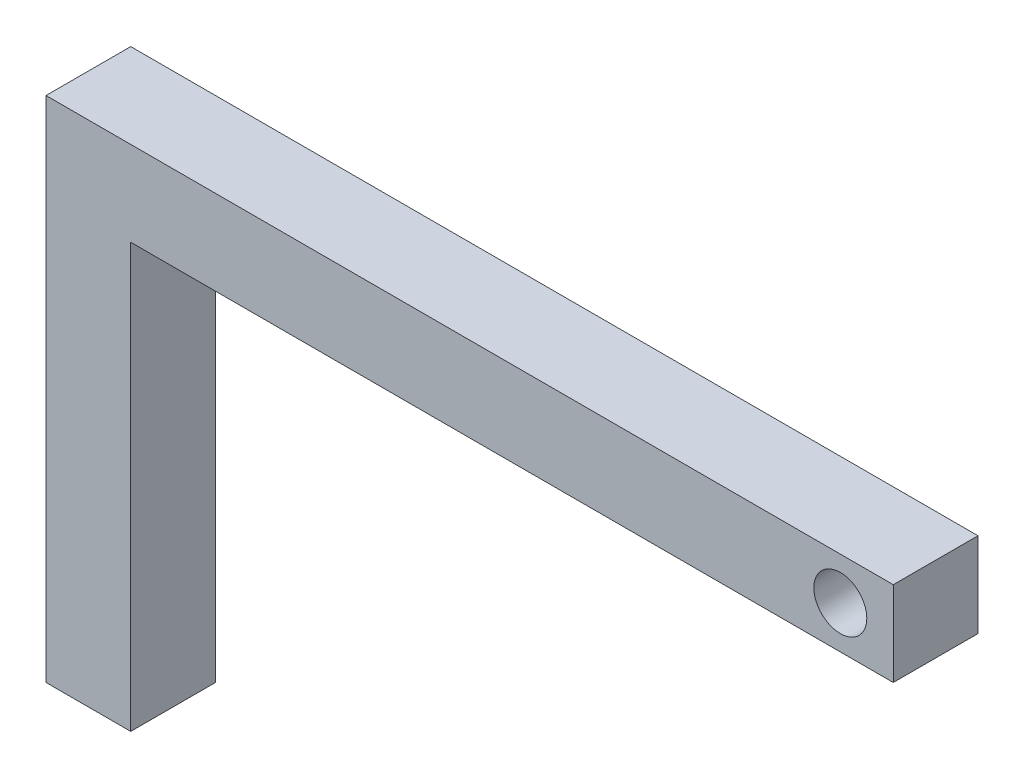
ISO-10303-21;
HEADER;
FILE_DESCRIPTION(('STEP AP214'),'2;1');
FILE_NAME('part.step','',(''),(''),'','','');
FILE_SCHEMA(('AUTOMOTIVE_DESIGN { 1 0 10303 214 1 1 1 1 }'));
ENDSEC;
DATA;
#1=APPLICATION_CONTEXT('core data for automotive mechanical design processes');
#2=APPLICATION_PROTOCOL_DEFINITION('international standard','automotive_design',2000,#1);
#3=PRODUCT_CONTEXT('',#1,'mechanical');
#4=PRODUCT('Part','Part','',(#3));
#5=PRODUCT_RELATED_PRODUCT_CATEGORY('part','',(#4));
#6=PRODUCT_DEFINITION_FORMATION('','',#4);
#7=PRODUCT_DEFINITION_CONTEXT('part definition',#1,'design');
#8=PRODUCT_DEFINITION('design','',#6,#7);
#9=PRODUCT_DEFINITION_SHAPE('','',#8);
#10=(LENGTH_UNIT() NAMED_UNIT(*) SI_UNIT(.MILLI.,.METRE.));
#11=(NAMED_UNIT(*) PLANE_ANGLE_UNIT() SI_UNIT($,.RADIAN.));
#12=(NAMED_UNIT(*) SI_UNIT($,.STERADIAN.) SOLID_ANGLE_UNIT());
#13=UNCERTAINTY_MEASURE_WITH_UNIT(LENGTH_MEASURE(1.E-05),#10,'distance_accuracy_value','');
#14=(GEOMETRIC_REPRESENTATION_CONTEXT(3) GLOBAL_UNCERTAINTY_ASSIGNED_CONTEXT((#13)) GLOBAL_UNIT_ASSIGNED_CONTEXT((#10,
#11,#12)) REPRESENTATION_CONTEXT('',''));
#15=CARTESIAN_POINT('',(0.,0.,0.));
#16=DIRECTION('',(0.,0.,1.));
#17=DIRECTION('',(1.,0.,0.));
#18=AXIS2_PLACEMENT_3D('',#15,#16,#17);
#19=CARTESIAN_POINT('',(80.,0.,80.));
#20=DIRECTION('',(0.,1.,0.));
#21=DIRECTION('',(0.,0.,1.));
#22=AXIS2_PLACEMENT_3D('',#19,#20,#21);
#23=PLANE('',#22);
#24=CARTESIAN_POINT('',(40.,0.,40.));
#25=DIRECTION('',(0.,-1.,0.));
#26=DIRECTION('',(0.,0.,-1.));
#27=AXIS2_PLACEMENT_3D('',#24,#25,#26);
#28=CIRCLE('',#27,15.);
#29=CARTESIAN_POINT('',(40.,0.,25.));
#30=VERTEX_POINT('',#29);
#31=EDGE_CURVE('E166',#30,#30,#28,.T.);
#32=ORIENTED_EDGE('',*,*,#31,.F.);
#33=EDGE_LOOP('',(#32));
#34=FACE_BOUND('',#33,.T.);
#35=DIRECTION('',(1.,0.,0.));
#36=VECTOR('',#35,1.);
#37=CARTESIAN_POINT('',(80.,0.,0.));
#38=LINE('',#37,#36);
#39=CARTESIAN_POINT('',(0.,0.,0.));
#40=VERTEX_POINT('',#39);
#41=CARTESIAN_POINT('',(80.,0.,0.));
#42=VERTEX_POINT('',#41);
#43=EDGE_CURVE('E123',#40,#42,#38,.T.);
#44=ORIENTED_EDGE('',*,*,#43,.T.);
#45=DIRECTION('',(0.,0.,-1.));
#46=VECTOR('',#45,1.);
#47=CARTESIAN_POINT('',(80.,0.,80.));
#48=LINE('',#47,#46);
#49=CARTESIAN_POINT('',(80.,0.,80.));
#50=VERTEX_POINT('',#49);
#51=EDGE_CURVE('E11',#50,#42,#48,.T.);
#52=ORIENTED_EDGE('',*,*,#51,.F.);
#53=DIRECTION('',(1.,0.,0.));
#54=VECTOR('',#53,1.);
#55=CARTESIAN_POINT('',(80.,0.,80.));
#56=LINE('',#55,#54);
#57=CARTESIAN_POINT('',(0.,0.,80.));
#58=VERTEX_POINT('',#57);
#59=EDGE_CURVE('E133',#58,#50,#56,.T.);
#60=ORIENTED_EDGE('',*,*,#59,.F.);
#61=DIRECTION('',(0.,0.,-1.));
#62=VECTOR('',#61,1.);
#63=CARTESIAN_POINT('',(0.,0.,80.));
#64=LINE('',#63,#62);
#65=EDGE_CURVE('E119',#58,#40,#64,.T.);
#66=ORIENTED_EDGE('',*,*,#65,.T.);
#67=EDGE_LOOP('',(#44,#52,#60,#66));
#68=FACE_BOUND('',#67,.T.);
#69=ADVANCED_FACE('F38',(#34,#68),#23,.F.);
#70=CARTESIAN_POINT('',(80.,400.000000000005,80.));
#71=DIRECTION('',(-1.,0.,0.));
#72=DIRECTION('',(0.,-1.,0.));
#73=AXIS2_PLACEMENT_3D('',#70,#71,#72);
#74=PLANE('',#73);
#75=DIRECTION('',(0.,1.,0.));
#76=VECTOR('',#75,1.);
#77=CARTESIAN_POINT('',(80.,400.000000000005,0.));
#78=LINE('',#77,#76);
#79=CARTESIAN_POINT('',(80.,400.000000000005,0.));
#80=VERTEX_POINT('',#79);
#81=EDGE_CURVE('E126',#42,#80,#78,.T.);
#82=ORIENTED_EDGE('',*,*,#81,.T.);
#83=DIRECTION('',(0.,0.,-1.));
#84=VECTOR('',#83,1.);
#85=CARTESIAN_POINT('',(80.,400.000000000005,80.));
#86=LINE('',#85,#84);
#87=CARTESIAN_POINT('',(80.,400.000000000005,80.));
#88=VERTEX_POINT('',#87);
#89=EDGE_CURVE('E47',#88,#80,#86,.T.);
#90=ORIENTED_EDGE('',*,*,#89,.F.);
#91=DIRECTION('',(0.,1.,0.));
#92=VECTOR('',#91,1.);
#93=CARTESIAN_POINT('',(80.,400.000000000005,80.));
#94=LINE('',#93,#92);
#95=EDGE_CURVE('E92',#50,#88,#94,.T.);
#96=ORIENTED_EDGE('',*,*,#95,.F.);
#97=ORIENTED_EDGE('',*,*,#51,.T.);
#98=EDGE_LOOP('',(#82,#90,#96,#97));
#99=FACE_BOUND('',#98,.T.);
#100=ADVANCED_FACE('F159',(#99),#74,.F.);
#101=CARTESIAN_POINT('',(800.,400.000000000005,80.));
#102=DIRECTION('',(0.,1.,0.));
#103=DIRECTION('',(-1.,0.,0.));
#104=AXIS2_PLACEMENT_3D('',#101,#102,#103);
#105=PLANE('',#104);
#106=DIRECTION('',(1.,0.,0.));
#107=VECTOR('',#106,1.);
#108=CARTESIAN_POINT('',(800.,400.000000000005,0.));
#109=LINE('',#108,#107);
#110=CARTESIAN_POINT('',(800.,400.000000000005,0.));
#111=VERTEX_POINT('',#110);
#112=EDGE_CURVE('E128',#80,#111,#109,.T.);
#113=ORIENTED_EDGE('',*,*,#112,.T.);
#114=DIRECTION('',(0.,0.,-1.));
#115=VECTOR('',#114,1.);
#116=CARTESIAN_POINT('',(800.,400.000000000005,80.));
#117=LINE('',#116,#115);
#118=CARTESIAN_POINT('',(800.,400.000000000005,80.));
#119=VERTEX_POINT('',#118);
#120=EDGE_CURVE('E114',#119,#111,#117,.T.);
#121=ORIENTED_EDGE('',*,*,#120,.F.);
#122=DIRECTION('',(1.,0.,0.));
#123=VECTOR('',#122,1.);
#124=CARTESIAN_POINT('',(800.,400.000000000005,80.));
#125=LINE('',#124,#123);
#126=EDGE_CURVE('E105',#88,#119,#125,.T.);
#127=ORIENTED_EDGE('',*,*,#126,.F.);
#128=ORIENTED_EDGE('',*,*,#89,.T.);
#129=EDGE_LOOP('',(#113,#121,#127,#128));
#130=FACE_BOUND('',#129,.T.);
#131=ADVANCED_FACE('F140',(#130),#105,.F.);
#132=CARTESIAN_POINT('',(800.,480.000000000005,80.));
#133=DIRECTION('',(-1.,0.,0.));
#134=DIRECTION('',(0.,0.,1.));
#135=AXIS2_PLACEMENT_3D('',#132,#133,#134);
#136=PLANE('',#135);
#137=DIRECTION('',(0.,1.,0.));
#138=VECTOR('',#137,1.);
#139=CARTESIAN_POINT('',(800.,480.000000000005,0.));
#140=LINE('',#139,#138);
#141=CARTESIAN_POINT('',(800.,480.000000000005,0.));
#142=VERTEX_POINT('',#141);
#143=EDGE_CURVE('E113',#111,#142,#140,.T.);
#144=ORIENTED_EDGE('',*,*,#143,.T.);
#145=DIRECTION('',(0.,0.,-1.));
#146=VECTOR('',#145,1.);
#147=CARTESIAN_POINT('',(800.,480.000000000005,80.));
#148=LINE('',#147,#146);
#149=CARTESIAN_POINT('',(800.,480.000000000005,80.));
#150=VERTEX_POINT('',#149);
#151=EDGE_CURVE('E110',#150,#142,#148,.T.);
#152=ORIENTED_EDGE('',*,*,#151,.F.);
#153=DIRECTION('',(0.,1.,0.));
#154=VECTOR('',#153,1.);
#155=CARTESIAN_POINT('',(800.,480.000000000005,80.));
#156=LINE('',#155,#154);
#157=EDGE_CURVE('E99',#119,#150,#156,.T.);
#158=ORIENTED_EDGE('',*,*,#157,.F.);
#159=ORIENTED_EDGE('',*,*,#120,.T.);
#160=EDGE_LOOP('',(#144,#152,#158,#159));
#161=FACE_BOUND('',#160,.T.);
#162=ADVANCED_FACE('F111',(#161),#136,.F.);
#163=CARTESIAN_POINT('',(0.,480.000000000005,80.));
#164=DIRECTION('',(0.,-1.,0.));
#165=DIRECTION('',(1.,0.,0.));
#166=AXIS2_PLACEMENT_3D('',#163,#164,#165);
#167=PLANE('',#166);
#168=DIRECTION('',(-1.,0.,0.));
#169=VECTOR('',#168,1.);
#170=CARTESIAN_POINT('',(0.,480.000000000005,0.));
#171=LINE('',#170,#169);
#172=CARTESIAN_POINT('',(0.,480.000000000005,0.));
#173=VERTEX_POINT('',#172);
#174=EDGE_CURVE('E78',#142,#173,#171,.T.);
#175=ORIENTED_EDGE('',*,*,#174,.T.);
#176=DIRECTION('',(0.,0.,-1.));
#177=VECTOR('',#176,1.);
#178=CARTESIAN_POINT('',(0.,480.000000000005,80.));
#179=LINE('',#178,#177);
#180=CARTESIAN_POINT('',(0.,480.000000000005,80.));
#181=VERTEX_POINT('',#180);
#182=EDGE_CURVE('E115',#181,#173,#179,.T.);
#183=ORIENTED_EDGE('',*,*,#182,.F.);
#184=DIRECTION('',(-1.,0.,0.));
#185=VECTOR('',#184,1.);
#186=CARTESIAN_POINT('',(0.,480.000000000005,80.));
#187=LINE('',#186,#185);
#188=EDGE_CURVE('E103',#150,#181,#187,.T.);
#189=ORIENTED_EDGE('',*,*,#188,.F.);
#190=ORIENTED_EDGE('',*,*,#151,.T.);
#191=EDGE_LOOP('',(#175,#183,#189,#190));
#192=FACE_BOUND('',#191,.T.);
#193=ADVANCED_FACE('F117',(#192),#167,.F.);
#194=CARTESIAN_POINT('',(0.,0.,80.));
#195=DIRECTION('',(1.,0.,0.));
#196=DIRECTION('',(0.,1.,0.));
#197=AXIS2_PLACEMENT_3D('',#194,#195,#196);
#198=PLANE('',#197);
#199=DIRECTION('',(0.,-1.,0.));
#200=VECTOR('',#199,1.);
#201=CARTESIAN_POINT('',(0.,0.,0.));
#202=LINE('',#201,#200);
#203=EDGE_CURVE('E84',#173,#40,#202,.T.);
#204=ORIENTED_EDGE('',*,*,#203,.T.);
#205=ORIENTED_EDGE('',*,*,#65,.F.);
#206=DIRECTION('',(0.,-1.,0.));
#207=VECTOR('',#206,1.);
#208=CARTESIAN_POINT('',(0.,0.,80.));
#209=LINE('',#208,#207);
#210=EDGE_CURVE('E55',#181,#58,#209,.T.);
#211=ORIENTED_EDGE('',*,*,#210,.F.);
#212=ORIENTED_EDGE('',*,*,#182,.T.);
#213=EDGE_LOOP('',(#204,#205,#211,#212));
#214=FACE_BOUND('',#213,.T.);
#215=ADVANCED_FACE('F147',(#214),#198,.F.);
#216=CARTESIAN_POINT('',(0.,0.,80.));
#217=DIRECTION('',(0.,0.,-1.));
#218=DIRECTION('',(-1.,0.,0.));
#219=AXIS2_PLACEMENT_3D('',#216,#217,#218);
#220=PLANE('',#219);
#221=CARTESIAN_POINT('',(750.,440.000000000005,80.));
#222=DIRECTION('',(0.,0.,1.));
#223=DIRECTION('',(1.,0.,0.));
#224=AXIS2_PLACEMENT_3D('',#221,#222,#223);
#225=CIRCLE('',#224,25.);
#226=CARTESIAN_POINT('',(775.,440.000000000005,80.));
#227=VERTEX_POINT('',#226);
#228=EDGE_CURVE('E171',#227,#227,#225,.T.);
#229=ORIENTED_EDGE('',*,*,#228,.F.);
#230=EDGE_LOOP('',(#229));
#231=FACE_BOUND('',#230,.T.);
#232=ORIENTED_EDGE('',*,*,#59,.T.);
#233=ORIENTED_EDGE('',*,*,#95,.T.);
#234=ORIENTED_EDGE('',*,*,#126,.T.);
#235=ORIENTED_EDGE('',*,*,#157,.T.);
#236=ORIENTED_EDGE('',*,*,#188,.T.);
#237=ORIENTED_EDGE('',*,*,#210,.T.);
#238=EDGE_LOOP('',(#232,#233,#234,#235,#236,#237));
#239=FACE_BOUND('',#238,.T.);
#240=ADVANCED_FACE('F101',(#231,#239),#220,.F.);
#241=CARTESIAN_POINT('',(0.,0.,0.));
#242=DIRECTION('',(0.,0.,-1.));
#243=DIRECTION('',(-1.,0.,0.));
#244=AXIS2_PLACEMENT_3D('',#241,#242,#243);
#245=PLANE('',#244);
#246=CARTESIAN_POINT('',(750.,440.000000000005,0.));
#247=DIRECTION('',(0.,0.,-1.));
#248=DIRECTION('',(-1.,0.,0.));
#249=AXIS2_PLACEMENT_3D('',#246,#247,#248);
#250=CIRCLE('',#249,25.);
#251=CARTESIAN_POINT('',(725.,440.000000000005,0.));
#252=VERTEX_POINT('',#251);
#253=EDGE_CURVE('E41',#252,#252,#250,.T.);
#254=ORIENTED_EDGE('',*,*,#253,.F.);
#255=EDGE_LOOP('',(#254));
#256=FACE_BOUND('',#255,.T.);
#257=ORIENTED_EDGE('',*,*,#43,.F.);
#258=ORIENTED_EDGE('',*,*,#203,.F.);
#259=ORIENTED_EDGE('',*,*,#174,.F.);
#260=ORIENTED_EDGE('',*,*,#143,.F.);
#261=ORIENTED_EDGE('',*,*,#112,.F.);
#262=ORIENTED_EDGE('',*,*,#81,.F.);
#263=EDGE_LOOP('',(#257,#258,#259,#260,#261,#262));
#264=FACE_BOUND('',#263,.T.);
#265=ADVANCED_FACE('F143',(#256,#264),#245,.T.);
#266=CARTESIAN_POINT('',(750.,440.000000000005,-81.));
#267=DIRECTION('',(0.,0.,1.));
#268=DIRECTION('',(1.,0.,0.));
#269=AXIS2_PLACEMENT_3D('',#266,#267,#268);
#270=CYLINDRICAL_SURFACE('',#269,25.);
#271=ORIENTED_EDGE('',*,*,#253,.T.);
#272=EDGE_LOOP('',(#271));
#273=FACE_BOUND('',#272,.T.);
#274=ORIENTED_EDGE('',*,*,#228,.T.);
#275=EDGE_LOOP('',(#274));
#276=FACE_BOUND('',#275,.T.);
#277=ADVANCED_FACE('F182',(#273,#276),#270,.F.);
#278=CARTESIAN_POINT('',(40.,10.,40.));
#279=DIRECTION('',(0.,-1.,0.));
#280=DIRECTION('',(0.,0.,-1.));
#281=AXIS2_PLACEMENT_3D('',#278,#279,#280);
#282=CYLINDRICAL_SURFACE('',#281,15.);
#283=CARTESIAN_POINT('',(40.,10.,40.));
#284=DIRECTION('',(0.,-1.,0.));
#285=DIRECTION('',(0.,0.,-1.));
#286=AXIS2_PLACEMENT_3D('',#283,#284,#285);
#287=CIRCLE('',#286,15.);
#288=CARTESIAN_POINT('',(40.,10.,25.));
#289=VERTEX_POINT('',#288);
#290=EDGE_CURVE('E168',#289,#289,#287,.T.);
#291=ORIENTED_EDGE('',*,*,#290,.F.);
#292=EDGE_LOOP('',(#291));
#293=FACE_BOUND('',#292,.T.);
#294=ORIENTED_EDGE('',*,*,#31,.T.);
#295=EDGE_LOOP('',(#294));
#296=FACE_BOUND('',#295,.T.);
#297=ADVANCED_FACE('F188',(#293,#296),#282,.F.);
#298=CARTESIAN_POINT('',(40.,10.,40.));
#299=DIRECTION('',(0.,-1.,0.));
#300=DIRECTION('',(0.,0.,-1.));
#301=AXIS2_PLACEMENT_3D('',#298,#299,#300);
#302=PLANE('',#301);
#303=ORIENTED_EDGE('',*,*,#290,.T.);
#304=EDGE_LOOP('',(#303));
#305=FACE_BOUND('',#304,.T.);
#306=ADVANCED_FACE('F193',(#305),#302,.T.);
#307=CLOSED_SHELL('',(#69,#100,#131,#162,#193,#215,#240,#265,#277,#297,#306));
#308=MANIFOLD_SOLID_BREP('B2',#307);
#309=ADVANCED_BREP_SHAPE_REPRESENTATION('',(#18,#308),#14);
#310=SHAPE_DEFINITION_REPRESENTATION(#9,#309);
ENDSEC;
END-ISO-10303-21;
